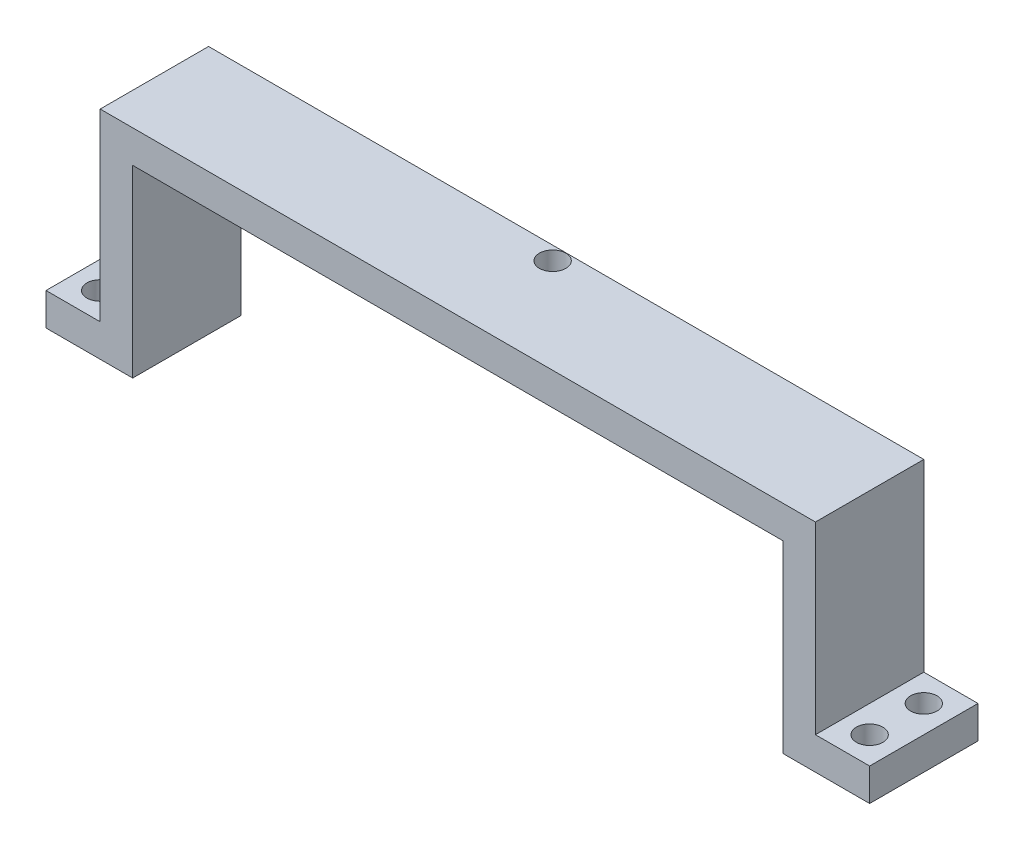
ISO-10303-21;
HEADER;
FILE_DESCRIPTION(('STEP AP214'),'2;1');
FILE_NAME('part.step','',(''),(''),'','','');
FILE_SCHEMA(('AUTOMOTIVE_DESIGN { 1 0 10303 214 1 1 1 1 }'));
ENDSEC;
DATA;
#1=APPLICATION_CONTEXT('core data for automotive mechanical design processes');
#2=APPLICATION_PROTOCOL_DEFINITION('international standard','automotive_design',2000,#1);
#3=PRODUCT_CONTEXT('',#1,'mechanical');
#4=PRODUCT('Part','Part','',(#3));
#5=PRODUCT_RELATED_PRODUCT_CATEGORY('part','',(#4));
#6=PRODUCT_DEFINITION_FORMATION('','',#4);
#7=PRODUCT_DEFINITION_CONTEXT('part definition',#1,'design');
#8=PRODUCT_DEFINITION('design','',#6,#7);
#9=PRODUCT_DEFINITION_SHAPE('','',#8);
#10=(LENGTH_UNIT() NAMED_UNIT(*) SI_UNIT(.MILLI.,.METRE.));
#11=(NAMED_UNIT(*) PLANE_ANGLE_UNIT() SI_UNIT($,.RADIAN.));
#12=(NAMED_UNIT(*) SI_UNIT($,.STERADIAN.) SOLID_ANGLE_UNIT());
#13=UNCERTAINTY_MEASURE_WITH_UNIT(LENGTH_MEASURE(1.E-05),#10,'distance_accuracy_value','');
#14=(GEOMETRIC_REPRESENTATION_CONTEXT(3) GLOBAL_UNCERTAINTY_ASSIGNED_CONTEXT((#13)) GLOBAL_UNIT_ASSIGNED_CONTEXT((#10,
#11,#12)) REPRESENTATION_CONTEXT('',''));
#15=CARTESIAN_POINT('',(0.,0.,0.));
#16=DIRECTION('',(0.,0.,1.));
#17=DIRECTION('',(1.,0.,0.));
#18=AXIS2_PLACEMENT_3D('',#15,#16,#17);
#19=CARTESIAN_POINT('',(0.,0.,0.));
#20=DIRECTION('',(0.,1.,0.));
#21=DIRECTION('',(0.,0.,1.));
#22=AXIS2_PLACEMENT_3D('',#19,#20,#21);
#23=PLANE('',#22);
#24=CARTESIAN_POINT('',(0.,0.,-3.74999999999999));
#25=DIRECTION('',(0.,1.,0.));
#26=DIRECTION('',(0.,0.,1.));
#27=AXIS2_PLACEMENT_3D('',#24,#25,#26);
#28=CIRCLE('',#27,1.22);
#29=CARTESIAN_POINT('',(0.,0.,-2.52999999999999));
#30=VERTEX_POINT('',#29);
#31=EDGE_CURVE('E237',#30,#30,#28,.T.);
#32=ORIENTED_EDGE('',*,*,#31,.T.);
#33=EDGE_LOOP('',(#32));
#34=FACE_BOUND('',#33,.T.);
#35=DIRECTION('',(0.,0.,-1.));
#36=VECTOR('',#35,1.);
#37=CARTESIAN_POINT('',(30.,0.,-5.00000000000001));
#38=LINE('',#37,#36);
#39=CARTESIAN_POINT('',(30.,0.,4.99999999999999));
#40=VERTEX_POINT('',#39);
#41=CARTESIAN_POINT('',(30.,0.,-5.00000000000001));
#42=VERTEX_POINT('',#41);
#43=EDGE_CURVE('E179',#40,#42,#38,.T.);
#44=ORIENTED_EDGE('',*,*,#43,.F.);
#45=DIRECTION('',(-1.,0.,0.));
#46=VECTOR('',#45,1.);
#47=CARTESIAN_POINT('',(0.,0.,5.));
#48=LINE('',#47,#46);
#49=CARTESIAN_POINT('',(-30.,0.,5.00000000000001));
#50=VERTEX_POINT('',#49);
#51=EDGE_CURVE('E37',#40,#50,#48,.T.);
#52=ORIENTED_EDGE('',*,*,#51,.T.);
#53=DIRECTION('',(0.,0.,1.));
#54=VECTOR('',#53,1.);
#55=CARTESIAN_POINT('',(-30.,0.,-4.99999999999999));
#56=LINE('',#55,#54);
#57=CARTESIAN_POINT('',(-30.,0.,-4.99999999999999));
#58=VERTEX_POINT('',#57);
#59=EDGE_CURVE('E56',#58,#50,#56,.T.);
#60=ORIENTED_EDGE('',*,*,#59,.F.);
#61=DIRECTION('',(1.,0.,0.));
#62=VECTOR('',#61,1.);
#63=CARTESIAN_POINT('',(0.,0.,-5.));
#64=LINE('',#63,#62);
#65=EDGE_CURVE('E51',#58,#42,#64,.T.);
#66=ORIENTED_EDGE('',*,*,#65,.T.);
#67=EDGE_LOOP('',(#44,#52,#60,#66));
#68=FACE_BOUND('',#67,.T.);
#69=ADVANCED_FACE('F33',(#34,#68),#23,.F.);
#70=CARTESIAN_POINT('',(33.,3.,0.));
#71=DIRECTION('',(1.,0.,0.));
#72=DIRECTION('',(0.,0.,-1.));
#73=AXIS2_PLACEMENT_3D('',#70,#71,#72);
#74=PLANE('',#73);
#75=DIRECTION('',(0.,-1.,0.));
#76=VECTOR('',#75,1.);
#77=CARTESIAN_POINT('',(33.,3.,4.99999999999999));
#78=LINE('',#77,#76);
#79=CARTESIAN_POINT('',(33.,3.,4.99999999999999));
#80=VERTEX_POINT('',#79);
#81=CARTESIAN_POINT('',(33.,-14.,4.99999999999999));
#82=VERTEX_POINT('',#81);
#83=EDGE_CURVE('E221',#80,#82,#78,.T.);
#84=ORIENTED_EDGE('',*,*,#83,.T.);
#85=DIRECTION('',(0.,0.,1.));
#86=VECTOR('',#85,1.);
#87=CARTESIAN_POINT('',(33.,-14.,4.99999999999999));
#88=LINE('',#87,#86);
#89=CARTESIAN_POINT('',(33.,-14.,-5.00000000000001));
#90=VERTEX_POINT('',#89);
#91=EDGE_CURVE('E180',#90,#82,#88,.T.);
#92=ORIENTED_EDGE('',*,*,#91,.F.);
#93=DIRECTION('',(0.,-1.,0.));
#94=VECTOR('',#93,1.);
#95=CARTESIAN_POINT('',(33.,3.,-5.00000000000001));
#96=LINE('',#95,#94);
#97=CARTESIAN_POINT('',(33.,3.,-5.00000000000001));
#98=VERTEX_POINT('',#97);
#99=EDGE_CURVE('E11',#98,#90,#96,.T.);
#100=ORIENTED_EDGE('',*,*,#99,.F.);
#101=DIRECTION('',(0.,0.,1.));
#102=VECTOR('',#101,1.);
#103=CARTESIAN_POINT('',(33.,3.,0.));
#104=LINE('',#103,#102);
#105=EDGE_CURVE('E196',#98,#80,#104,.T.);
#106=ORIENTED_EDGE('',*,*,#105,.T.);
#107=EDGE_LOOP('',(#84,#92,#100,#106));
#108=FACE_BOUND('',#107,.T.);
#109=ADVANCED_FACE('F35',(#108),#74,.T.);
#110=CARTESIAN_POINT('',(0.,3.,-5.));
#111=DIRECTION('',(0.,0.,-1.));
#112=DIRECTION('',(-1.,0.,0.));
#113=AXIS2_PLACEMENT_3D('',#110,#111,#112);
#114=PLANE('',#113);
#115=ORIENTED_EDGE('',*,*,#65,.F.);
#116=DIRECTION('',(0.,1.,0.));
#117=VECTOR('',#116,1.);
#118=CARTESIAN_POINT('',(-30.,-14.,-4.99999999999999));
#119=LINE('',#118,#117);
#120=CARTESIAN_POINT('',(-30.,-17.,-4.99999999999999));
#121=VERTEX_POINT('',#120);
#122=EDGE_CURVE('E132',#121,#58,#119,.T.);
#123=ORIENTED_EDGE('',*,*,#122,.F.);
#124=DIRECTION('',(1.,0.,0.));
#125=VECTOR('',#124,1.);
#126=CARTESIAN_POINT('',(0.,-17.,-5.));
#127=LINE('',#126,#125);
#128=CARTESIAN_POINT('',(-38.,-17.,-4.99999999999999));
#129=VERTEX_POINT('',#128);
#130=EDGE_CURVE('E124',#129,#121,#127,.T.);
#131=ORIENTED_EDGE('',*,*,#130,.F.);
#132=DIRECTION('',(0.,1.,0.));
#133=VECTOR('',#132,1.);
#134=CARTESIAN_POINT('',(-38.,-17.,-4.99999999999999));
#135=LINE('',#134,#133);
#136=CARTESIAN_POINT('',(-38.,-14.,-4.99999999999999));
#137=VERTEX_POINT('',#136);
#138=EDGE_CURVE('E129',#129,#137,#135,.T.);
#139=ORIENTED_EDGE('',*,*,#138,.T.);
#140=DIRECTION('',(1.,0.,0.));
#141=VECTOR('',#140,1.);
#142=CARTESIAN_POINT('',(0.,-14.,-5.));
#143=LINE('',#142,#141);
#144=CARTESIAN_POINT('',(-33.,-14.,-4.99999999999999));
#145=VERTEX_POINT('',#144);
#146=EDGE_CURVE('E235',#137,#145,#143,.T.);
#147=ORIENTED_EDGE('',*,*,#146,.T.);
#148=DIRECTION('',(0.,-1.,0.));
#149=VECTOR('',#148,1.);
#150=CARTESIAN_POINT('',(-33.,3.,-4.99999999999999));
#151=LINE('',#150,#149);
#152=CARTESIAN_POINT('',(-33.,3.,-4.99999999999999));
#153=VERTEX_POINT('',#152);
#154=EDGE_CURVE('E43',#153,#145,#151,.T.);
#155=ORIENTED_EDGE('',*,*,#154,.F.);
#156=DIRECTION('',(1.,0.,0.));
#157=VECTOR('',#156,1.);
#158=CARTESIAN_POINT('',(0.,3.,-5.));
#159=LINE('',#158,#157);
#160=EDGE_CURVE('E209',#153,#98,#159,.T.);
#161=ORIENTED_EDGE('',*,*,#160,.T.);
#162=ORIENTED_EDGE('',*,*,#99,.T.);
#163=DIRECTION('',(1.,0.,0.));
#164=VECTOR('',#163,1.);
#165=CARTESIAN_POINT('',(0.,-14.,-5.00000000000001));
#166=LINE('',#165,#164);
#167=CARTESIAN_POINT('',(38.,-14.,-5.00000000000001));
#168=VERTEX_POINT('',#167);
#169=EDGE_CURVE('E155',#90,#168,#166,.T.);
#170=ORIENTED_EDGE('',*,*,#169,.T.);
#171=DIRECTION('',(0.,1.,0.));
#172=VECTOR('',#171,1.);
#173=CARTESIAN_POINT('',(38.,-17.,-5.00000000000001));
#174=LINE('',#173,#172);
#175=CARTESIAN_POINT('',(38.,-17.,-5.00000000000001));
#176=VERTEX_POINT('',#175);
#177=EDGE_CURVE('E176',#176,#168,#174,.T.);
#178=ORIENTED_EDGE('',*,*,#177,.F.);
#179=DIRECTION('',(1.,0.,0.));
#180=VECTOR('',#179,1.);
#181=CARTESIAN_POINT('',(0.,-17.,-5.00000000000001));
#182=LINE('',#181,#180);
#183=CARTESIAN_POINT('',(30.,-17.,-5.00000000000001));
#184=VERTEX_POINT('',#183);
#185=EDGE_CURVE('E167',#184,#176,#182,.T.);
#186=ORIENTED_EDGE('',*,*,#185,.F.);
#187=DIRECTION('',(0.,1.,0.));
#188=VECTOR('',#187,1.);
#189=CARTESIAN_POINT('',(30.,-14.,-5.00000000000001));
#190=LINE('',#189,#188);
#191=EDGE_CURVE('E183',#184,#42,#190,.T.);
#192=ORIENTED_EDGE('',*,*,#191,.T.);
#193=EDGE_LOOP('',(#115,#123,#131,#139,#147,#155,#161,#162,#170,#178,#186,#192));
#194=FACE_BOUND('',#193,.T.);
#195=ADVANCED_FACE('F126',(#194),#114,.T.);
#196=CARTESIAN_POINT('',(-33.,3.,0.));
#197=DIRECTION('',(-1.,0.,0.));
#198=DIRECTION('',(0.,0.,1.));
#199=AXIS2_PLACEMENT_3D('',#196,#197,#198);
#200=PLANE('',#199);
#201=ORIENTED_EDGE('',*,*,#154,.T.);
#202=DIRECTION('',(0.,0.,-1.));
#203=VECTOR('',#202,1.);
#204=CARTESIAN_POINT('',(-33.,-14.,5.00000000000001));
#205=LINE('',#204,#203);
#206=CARTESIAN_POINT('',(-33.,-14.,5.00000000000001));
#207=VERTEX_POINT('',#206);
#208=EDGE_CURVE('E190',#207,#145,#205,.T.);
#209=ORIENTED_EDGE('',*,*,#208,.F.);
#210=DIRECTION('',(0.,-1.,0.));
#211=VECTOR('',#210,1.);
#212=CARTESIAN_POINT('',(-33.,3.,5.00000000000001));
#213=LINE('',#212,#211);
#214=CARTESIAN_POINT('',(-33.,3.,5.00000000000001));
#215=VERTEX_POINT('',#214);
#216=EDGE_CURVE('E226',#215,#207,#213,.T.);
#217=ORIENTED_EDGE('',*,*,#216,.F.);
#218=DIRECTION('',(0.,0.,-1.));
#219=VECTOR('',#218,1.);
#220=CARTESIAN_POINT('',(-33.,3.,0.));
#221=LINE('',#220,#219);
#222=EDGE_CURVE('E214',#215,#153,#221,.T.);
#223=ORIENTED_EDGE('',*,*,#222,.T.);
#224=EDGE_LOOP('',(#201,#209,#217,#223));
#225=FACE_BOUND('',#224,.T.);
#226=ADVANCED_FACE('F230',(#225),#200,.T.);
#227=CARTESIAN_POINT('',(0.,3.,5.));
#228=DIRECTION('',(0.,0.,1.));
#229=DIRECTION('',(1.,0.,0.));
#230=AXIS2_PLACEMENT_3D('',#227,#228,#229);
#231=PLANE('',#230);
#232=ORIENTED_EDGE('',*,*,#51,.F.);
#233=DIRECTION('',(0.,1.,0.));
#234=VECTOR('',#233,1.);
#235=CARTESIAN_POINT('',(30.,-14.,4.99999999999999));
#236=LINE('',#235,#234);
#237=CARTESIAN_POINT('',(30.,-17.,4.99999999999999));
#238=VERTEX_POINT('',#237);
#239=EDGE_CURVE('E187',#238,#40,#236,.T.);
#240=ORIENTED_EDGE('',*,*,#239,.F.);
#241=DIRECTION('',(-1.,0.,0.));
#242=VECTOR('',#241,1.);
#243=CARTESIAN_POINT('',(0.,-17.,4.99999999999992));
#244=LINE('',#243,#242);
#245=CARTESIAN_POINT('',(38.,-17.,5.00000000000001));
#246=VERTEX_POINT('',#245);
#247=EDGE_CURVE('E160',#246,#238,#244,.T.);
#248=ORIENTED_EDGE('',*,*,#247,.F.);
#249=DIRECTION('',(0.,1.,0.));
#250=VECTOR('',#249,1.);
#251=CARTESIAN_POINT('',(38.,-17.,5.00000000000001));
#252=LINE('',#251,#250);
#253=CARTESIAN_POINT('',(38.,-14.,5.00000000000001));
#254=VERTEX_POINT('',#253);
#255=EDGE_CURVE('E170',#246,#254,#252,.T.);
#256=ORIENTED_EDGE('',*,*,#255,.T.);
#257=DIRECTION('',(-1.,0.,0.));
#258=VECTOR('',#257,1.);
#259=CARTESIAN_POINT('',(0.,-14.,4.99999999999992));
#260=LINE('',#259,#258);
#261=EDGE_CURVE('E151',#254,#82,#260,.T.);
#262=ORIENTED_EDGE('',*,*,#261,.T.);
#263=ORIENTED_EDGE('',*,*,#83,.F.);
#264=DIRECTION('',(-1.,0.,0.));
#265=VECTOR('',#264,1.);
#266=CARTESIAN_POINT('',(0.,3.,5.));
#267=LINE('',#266,#265);
#268=EDGE_CURVE('E217',#80,#215,#267,.T.);
#269=ORIENTED_EDGE('',*,*,#268,.T.);
#270=ORIENTED_EDGE('',*,*,#216,.T.);
#271=DIRECTION('',(-1.,0.,0.));
#272=VECTOR('',#271,1.);
#273=CARTESIAN_POINT('',(0.,-14.,5.00000000000001));
#274=LINE('',#273,#272);
#275=CARTESIAN_POINT('',(-38.,-14.,5.00000000000001));
#276=VERTEX_POINT('',#275);
#277=EDGE_CURVE('E146',#207,#276,#274,.T.);
#278=ORIENTED_EDGE('',*,*,#277,.T.);
#279=DIRECTION('',(0.,1.,0.));
#280=VECTOR('',#279,1.);
#281=CARTESIAN_POINT('',(-38.,-17.,5.00000000000001));
#282=LINE('',#281,#280);
#283=CARTESIAN_POINT('',(-38.,-17.,5.00000000000001));
#284=VERTEX_POINT('',#283);
#285=EDGE_CURVE('E152',#284,#276,#282,.T.);
#286=ORIENTED_EDGE('',*,*,#285,.F.);
#287=DIRECTION('',(-1.,0.,0.));
#288=VECTOR('',#287,1.);
#289=CARTESIAN_POINT('',(0.,-17.,5.00000000000001));
#290=LINE('',#289,#288);
#291=CARTESIAN_POINT('',(-30.,-17.,5.00000000000001));
#292=VERTEX_POINT('',#291);
#293=EDGE_CURVE('E142',#292,#284,#290,.T.);
#294=ORIENTED_EDGE('',*,*,#293,.F.);
#295=DIRECTION('',(0.,1.,0.));
#296=VECTOR('',#295,1.);
#297=CARTESIAN_POINT('',(-30.,-14.,5.00000000000001));
#298=LINE('',#297,#296);
#299=EDGE_CURVE('E193',#292,#50,#298,.T.);
#300=ORIENTED_EDGE('',*,*,#299,.T.);
#301=EDGE_LOOP('',(#232,#240,#248,#256,#262,#263,#269,#270,#278,#286,#294,#300));
#302=FACE_BOUND('',#301,.T.);
#303=ADVANCED_FACE('F297',(#302),#231,.T.);
#304=CARTESIAN_POINT('',(0.,3.,0.));
#305=DIRECTION('',(0.,1.,0.));
#306=DIRECTION('',(0.,0.,1.));
#307=AXIS2_PLACEMENT_3D('',#304,#305,#306);
#308=PLANE('',#307);
#309=CARTESIAN_POINT('',(0.,3.,-3.74999999999999));
#310=DIRECTION('',(0.,1.,0.));
#311=DIRECTION('',(0.,0.,1.));
#312=AXIS2_PLACEMENT_3D('',#309,#310,#311);
#313=CIRCLE('',#312,1.22);
#314=CARTESIAN_POINT('',(0.,3.,-2.52999999999999));
#315=VERTEX_POINT('',#314);
#316=EDGE_CURVE('E244',#315,#315,#313,.T.);
#317=ORIENTED_EDGE('',*,*,#316,.F.);
#318=EDGE_LOOP('',(#317));
#319=FACE_BOUND('',#318,.T.);
#320=ORIENTED_EDGE('',*,*,#105,.F.);
#321=ORIENTED_EDGE('',*,*,#160,.F.);
#322=ORIENTED_EDGE('',*,*,#222,.F.);
#323=ORIENTED_EDGE('',*,*,#268,.F.);
#324=EDGE_LOOP('',(#320,#321,#322,#323));
#325=FACE_BOUND('',#324,.T.);
#326=ADVANCED_FACE('F295',(#319,#325),#308,.T.);
#327=CARTESIAN_POINT('',(-30.,-14.,-4.99999999999999));
#328=DIRECTION('',(-1.,0.,0.));
#329=DIRECTION('',(0.,0.,1.));
#330=AXIS2_PLACEMENT_3D('',#327,#328,#329);
#331=PLANE('',#330);
#332=ORIENTED_EDGE('',*,*,#59,.T.);
#333=ORIENTED_EDGE('',*,*,#299,.F.);
#334=DIRECTION('',(0.,0.,1.));
#335=VECTOR('',#334,1.);
#336=CARTESIAN_POINT('',(-30.,-17.,0.));
#337=LINE('',#336,#335);
#338=EDGE_CURVE('E136',#121,#292,#337,.T.);
#339=ORIENTED_EDGE('',*,*,#338,.F.);
#340=ORIENTED_EDGE('',*,*,#122,.T.);
#341=EDGE_LOOP('',(#332,#333,#339,#340));
#342=FACE_BOUND('',#341,.T.);
#343=ADVANCED_FACE('F322',(#342),#331,.F.);
#344=CARTESIAN_POINT('',(30.,-14.,-5.00000000000001));
#345=DIRECTION('',(1.,0.,0.));
#346=DIRECTION('',(0.,0.,-1.));
#347=AXIS2_PLACEMENT_3D('',#344,#345,#346);
#348=PLANE('',#347);
#349=ORIENTED_EDGE('',*,*,#43,.T.);
#350=ORIENTED_EDGE('',*,*,#191,.F.);
#351=DIRECTION('',(0.,0.,-1.));
#352=VECTOR('',#351,1.);
#353=CARTESIAN_POINT('',(30.,-17.,0.));
#354=LINE('',#353,#352);
#355=EDGE_CURVE('E163',#238,#184,#354,.T.);
#356=ORIENTED_EDGE('',*,*,#355,.F.);
#357=ORIENTED_EDGE('',*,*,#239,.T.);
#358=EDGE_LOOP('',(#349,#350,#356,#357));
#359=FACE_BOUND('',#358,.T.);
#360=ADVANCED_FACE('F329',(#359),#348,.F.);
#361=CARTESIAN_POINT('',(38.,-17.,0.));
#362=DIRECTION('',(-1.,0.,0.));
#363=DIRECTION('',(0.,0.,1.));
#364=AXIS2_PLACEMENT_3D('',#361,#362,#363);
#365=PLANE('',#364);
#366=DIRECTION('',(0.,0.,1.));
#367=VECTOR('',#366,1.);
#368=CARTESIAN_POINT('',(38.,-14.,0.));
#369=LINE('',#368,#367);
#370=EDGE_CURVE('E164',#168,#254,#369,.T.);
#371=ORIENTED_EDGE('',*,*,#370,.T.);
#372=ORIENTED_EDGE('',*,*,#255,.F.);
#373=DIRECTION('',(0.,0.,1.));
#374=VECTOR('',#373,1.);
#375=CARTESIAN_POINT('',(38.,-17.,0.));
#376=LINE('',#375,#374);
#377=EDGE_CURVE('E169',#176,#246,#376,.T.);
#378=ORIENTED_EDGE('',*,*,#377,.F.);
#379=ORIENTED_EDGE('',*,*,#177,.T.);
#380=EDGE_LOOP('',(#371,#372,#378,#379));
#381=FACE_BOUND('',#380,.T.);
#382=ADVANCED_FACE('F335',(#381),#365,.F.);
#383=CARTESIAN_POINT('',(0.,-17.,0.));
#384=DIRECTION('',(0.,-1.,0.));
#385=DIRECTION('',(0.,0.,-1.));
#386=AXIS2_PLACEMENT_3D('',#383,#384,#385);
#387=PLANE('',#386);
#388=CARTESIAN_POINT('',(35.5,-17.,-2.49999999999999));
#389=DIRECTION('',(0.,-1.,0.));
#390=DIRECTION('',(0.,0.,-1.));
#391=AXIS2_PLACEMENT_3D('',#388,#389,#390);
#392=CIRCLE('',#391,1.22);
#393=CARTESIAN_POINT('',(35.5,-17.,-3.71999999999999));
#394=VERTEX_POINT('',#393);
#395=EDGE_CURVE('E265',#394,#394,#392,.F.);
#396=ORIENTED_EDGE('',*,*,#395,.T.);
#397=EDGE_LOOP('',(#396));
#398=FACE_BOUND('',#397,.T.);
#399=CARTESIAN_POINT('',(35.5,-17.,2.50000000000001));
#400=DIRECTION('',(0.,-1.,0.));
#401=DIRECTION('',(0.,0.,-1.));
#402=AXIS2_PLACEMENT_3D('',#399,#400,#401);
#403=CIRCLE('',#402,1.22);
#404=CARTESIAN_POINT('',(35.5,-17.,1.28000000000001));
#405=VERTEX_POINT('',#404);
#406=EDGE_CURVE('E259',#405,#405,#403,.F.);
#407=ORIENTED_EDGE('',*,*,#406,.T.);
#408=EDGE_LOOP('',(#407));
#409=FACE_BOUND('',#408,.T.);
#410=ORIENTED_EDGE('',*,*,#247,.T.);
#411=ORIENTED_EDGE('',*,*,#355,.T.);
#412=ORIENTED_EDGE('',*,*,#185,.T.);
#413=ORIENTED_EDGE('',*,*,#377,.T.);
#414=EDGE_LOOP('',(#410,#411,#412,#413));
#415=FACE_BOUND('',#414,.T.);
#416=ADVANCED_FACE('F343',(#398,#409,#415),#387,.T.);
#417=CARTESIAN_POINT('',(0.,-14.,0.));
#418=DIRECTION('',(0.,-1.,0.));
#419=DIRECTION('',(0.,0.,-1.));
#420=AXIS2_PLACEMENT_3D('',#417,#418,#419);
#421=PLANE('',#420);
#422=CARTESIAN_POINT('',(35.5,-14.,-2.49999999999999));
#423=DIRECTION('',(0.,-1.,0.));
#424=DIRECTION('',(0.,0.,1.));
#425=AXIS2_PLACEMENT_3D('',#422,#423,#424);
#426=CIRCLE('',#425,1.22);
#427=CARTESIAN_POINT('',(35.5,-14.,-1.27999999999999));
#428=VERTEX_POINT('',#427);
#429=EDGE_CURVE('E268',#428,#428,#426,.T.);
#430=ORIENTED_EDGE('',*,*,#429,.T.);
#431=EDGE_LOOP('',(#430));
#432=FACE_BOUND('',#431,.T.);
#433=CARTESIAN_POINT('',(35.5,-14.,2.50000000000001));
#434=DIRECTION('',(0.,-1.,0.));
#435=DIRECTION('',(0.,0.,1.));
#436=AXIS2_PLACEMENT_3D('',#433,#434,#435);
#437=CIRCLE('',#436,1.22);
#438=CARTESIAN_POINT('',(35.5,-14.,3.72000000000001));
#439=VERTEX_POINT('',#438);
#440=EDGE_CURVE('E262',#439,#439,#437,.T.);
#441=ORIENTED_EDGE('',*,*,#440,.T.);
#442=EDGE_LOOP('',(#441));
#443=FACE_BOUND('',#442,.T.);
#444=ORIENTED_EDGE('',*,*,#91,.T.);
#445=ORIENTED_EDGE('',*,*,#261,.F.);
#446=ORIENTED_EDGE('',*,*,#370,.F.);
#447=ORIENTED_EDGE('',*,*,#169,.F.);
#448=EDGE_LOOP('',(#444,#445,#446,#447));
#449=FACE_BOUND('',#448,.T.);
#450=ADVANCED_FACE('F272',(#432,#443,#449),#421,.F.);
#451=CARTESIAN_POINT('',(-38.,-17.,0.));
#452=DIRECTION('',(1.,0.,0.));
#453=DIRECTION('',(0.,0.,-1.));
#454=AXIS2_PLACEMENT_3D('',#451,#452,#453);
#455=PLANE('',#454);
#456=DIRECTION('',(0.,0.,-1.));
#457=VECTOR('',#456,1.);
#458=CARTESIAN_POINT('',(-38.,-14.,0.));
#459=LINE('',#458,#457);
#460=EDGE_CURVE('E150',#276,#137,#459,.T.);
#461=ORIENTED_EDGE('',*,*,#460,.T.);
#462=ORIENTED_EDGE('',*,*,#138,.F.);
#463=DIRECTION('',(0.,0.,-1.));
#464=VECTOR('',#463,1.);
#465=CARTESIAN_POINT('',(-38.,-17.,0.));
#466=LINE('',#465,#464);
#467=EDGE_CURVE('E137',#284,#129,#466,.T.);
#468=ORIENTED_EDGE('',*,*,#467,.F.);
#469=ORIENTED_EDGE('',*,*,#285,.T.);
#470=EDGE_LOOP('',(#461,#462,#468,#469));
#471=FACE_BOUND('',#470,.T.);
#472=ADVANCED_FACE('F148',(#471),#455,.F.);
#473=CARTESIAN_POINT('',(0.,-17.,0.));
#474=DIRECTION('',(0.,-1.,0.));
#475=DIRECTION('',(0.,0.,-1.));
#476=AXIS2_PLACEMENT_3D('',#473,#474,#475);
#477=PLANE('',#476);
#478=CARTESIAN_POINT('',(-35.5,-17.,-2.49999999999999));
#479=DIRECTION('',(0.,-1.,0.));
#480=DIRECTION('',(0.,0.,-1.));
#481=AXIS2_PLACEMENT_3D('',#478,#479,#480);
#482=CIRCLE('',#481,1.22);
#483=CARTESIAN_POINT('',(-35.5,-17.,-3.71999999999999));
#484=VERTEX_POINT('',#483);
#485=EDGE_CURVE('E253',#484,#484,#482,.T.);
#486=ORIENTED_EDGE('',*,*,#485,.F.);
#487=EDGE_LOOP('',(#486));
#488=FACE_BOUND('',#487,.T.);
#489=CARTESIAN_POINT('',(-35.5,-17.,2.50000000000001));
#490=DIRECTION('',(0.,-1.,0.));
#491=DIRECTION('',(0.,0.,-1.));
#492=AXIS2_PLACEMENT_3D('',#489,#490,#491);
#493=CIRCLE('',#492,1.22);
#494=CARTESIAN_POINT('',(-35.5,-17.,1.28000000000001));
#495=VERTEX_POINT('',#494);
#496=EDGE_CURVE('E247',#495,#495,#493,.T.);
#497=ORIENTED_EDGE('',*,*,#496,.F.);
#498=EDGE_LOOP('',(#497));
#499=FACE_BOUND('',#498,.T.);
#500=ORIENTED_EDGE('',*,*,#467,.T.);
#501=ORIENTED_EDGE('',*,*,#130,.T.);
#502=ORIENTED_EDGE('',*,*,#338,.T.);
#503=ORIENTED_EDGE('',*,*,#293,.T.);
#504=EDGE_LOOP('',(#500,#501,#502,#503));
#505=FACE_BOUND('',#504,.T.);
#506=ADVANCED_FACE('F140',(#488,#499,#505),#477,.T.);
#507=CARTESIAN_POINT('',(0.,-14.,0.));
#508=DIRECTION('',(0.,-1.,0.));
#509=DIRECTION('',(0.,0.,-1.));
#510=AXIS2_PLACEMENT_3D('',#507,#508,#509);
#511=PLANE('',#510);
#512=CARTESIAN_POINT('',(-35.5,-14.,-2.49999999999999));
#513=DIRECTION('',(0.,1.,0.));
#514=DIRECTION('',(0.,0.,1.));
#515=AXIS2_PLACEMENT_3D('',#512,#513,#514);
#516=CIRCLE('',#515,1.22);
#517=CARTESIAN_POINT('',(-35.5,-14.,-1.27999999999999));
#518=VERTEX_POINT('',#517);
#519=EDGE_CURVE('E256',#518,#518,#516,.T.);
#520=ORIENTED_EDGE('',*,*,#519,.F.);
#521=EDGE_LOOP('',(#520));
#522=FACE_BOUND('',#521,.T.);
#523=CARTESIAN_POINT('',(-35.5,-14.,2.50000000000001));
#524=DIRECTION('',(0.,1.,0.));
#525=DIRECTION('',(0.,0.,1.));
#526=AXIS2_PLACEMENT_3D('',#523,#524,#525);
#527=CIRCLE('',#526,1.22);
#528=CARTESIAN_POINT('',(-35.5,-14.,3.72000000000001));
#529=VERTEX_POINT('',#528);
#530=EDGE_CURVE('E250',#529,#529,#527,.T.);
#531=ORIENTED_EDGE('',*,*,#530,.F.);
#532=EDGE_LOOP('',(#531));
#533=FACE_BOUND('',#532,.T.);
#534=ORIENTED_EDGE('',*,*,#208,.T.);
#535=ORIENTED_EDGE('',*,*,#146,.F.);
#536=ORIENTED_EDGE('',*,*,#460,.F.);
#537=ORIENTED_EDGE('',*,*,#277,.F.);
#538=EDGE_LOOP('',(#534,#535,#536,#537));
#539=FACE_BOUND('',#538,.T.);
#540=ADVANCED_FACE('F234',(#522,#533,#539),#511,.F.);
#541=CARTESIAN_POINT('',(0.,-17.000025,-3.74999999999999));
#542=DIRECTION('',(0.,1.,0.));
#543=DIRECTION('',(0.,0.,1.));
#544=AXIS2_PLACEMENT_3D('',#541,#542,#543);
#545=CYLINDRICAL_SURFACE('',#544,1.22);
#546=CARTESIAN_POINT('',(0.,3.,-2.52999999999999));
#547=CARTESIAN_POINT('',(0.,2.96875,-2.52999999999999));
#548=CARTESIAN_POINT('',(0.,2.9375,-2.52999999999999));
#549=CARTESIAN_POINT('',(0.,2.875,-2.52999999999999));
#550=CARTESIAN_POINT('',(0.,2.84375,-2.52999999999999));
#551=CARTESIAN_POINT('',(0.,2.78125,-2.52999999999999));
#552=CARTESIAN_POINT('',(0.,2.75,-2.52999999999999));
#553=CARTESIAN_POINT('',(0.,2.6875,-2.52999999999999));
#554=CARTESIAN_POINT('',(0.,2.65625,-2.52999999999999));
#555=CARTESIAN_POINT('',(0.,2.59375,-2.52999999999999));
#556=CARTESIAN_POINT('',(0.,2.5625,-2.52999999999999));
#557=CARTESIAN_POINT('',(0.,2.5,-2.52999999999999));
#558=CARTESIAN_POINT('',(0.,2.46875,-2.52999999999999));
#559=CARTESIAN_POINT('',(0.,2.40625,-2.52999999999999));
#560=CARTESIAN_POINT('',(0.,2.375,-2.52999999999999));
#561=CARTESIAN_POINT('',(0.,2.3125,-2.52999999999999));
#562=CARTESIAN_POINT('',(0.,2.28125,-2.52999999999999));
#563=CARTESIAN_POINT('',(0.,2.21875,-2.52999999999999));
#564=CARTESIAN_POINT('',(0.,2.1875,-2.52999999999999));
#565=CARTESIAN_POINT('',(0.,2.125,-2.52999999999999));
#566=CARTESIAN_POINT('',(0.,2.09375,-2.52999999999999));
#567=CARTESIAN_POINT('',(0.,2.03125,-2.52999999999999));
#568=CARTESIAN_POINT('',(0.,2.,-2.52999999999999));
#569=CARTESIAN_POINT('',(0.,1.9375,-2.52999999999999));
#570=CARTESIAN_POINT('',(0.,1.90625,-2.52999999999999));
#571=CARTESIAN_POINT('',(0.,1.84375,-2.52999999999999));
#572=CARTESIAN_POINT('',(0.,1.8125,-2.52999999999999));
#573=CARTESIAN_POINT('',(0.,1.75,-2.52999999999999));
#574=CARTESIAN_POINT('',(0.,1.71875,-2.52999999999999));
#575=CARTESIAN_POINT('',(0.,1.65625,-2.52999999999999));
#576=CARTESIAN_POINT('',(0.,1.625,-2.52999999999999));
#577=CARTESIAN_POINT('',(0.,1.5625,-2.52999999999999));
#578=CARTESIAN_POINT('',(0.,1.53125,-2.52999999999999));
#579=CARTESIAN_POINT('',(0.,1.46875,-2.52999999999999));
#580=CARTESIAN_POINT('',(0.,1.4375,-2.52999999999999));
#581=CARTESIAN_POINT('',(0.,1.375,-2.52999999999999));
#582=CARTESIAN_POINT('',(0.,1.34375,-2.52999999999999));
#583=CARTESIAN_POINT('',(0.,1.28125,-2.52999999999999));
#584=CARTESIAN_POINT('',(0.,1.25,-2.52999999999999));
#585=CARTESIAN_POINT('',(0.,1.1875,-2.52999999999999));
#586=CARTESIAN_POINT('',(0.,1.15625,-2.52999999999999));
#587=CARTESIAN_POINT('',(0.,1.09375,-2.52999999999999));
#588=CARTESIAN_POINT('',(0.,1.0625,-2.52999999999999));
#589=CARTESIAN_POINT('',(0.,0.999999999999997,-2.52999999999999));
#590=CARTESIAN_POINT('',(0.,0.968749999999997,-2.52999999999999));
#591=CARTESIAN_POINT('',(0.,0.906249999999997,-2.52999999999999));
#592=CARTESIAN_POINT('',(0.,0.874999999999997,-2.52999999999999));
#593=CARTESIAN_POINT('',(0.,0.812499999999997,-2.52999999999999));
#594=CARTESIAN_POINT('',(0.,0.781249999999997,-2.52999999999999));
#595=CARTESIAN_POINT('',(0.,0.718749999999997,-2.52999999999999));
#596=CARTESIAN_POINT('',(0.,0.687499999999997,-2.52999999999999));
#597=CARTESIAN_POINT('',(0.,0.624999999999997,-2.52999999999999));
#598=CARTESIAN_POINT('',(0.,0.593749999999997,-2.52999999999999));
#599=CARTESIAN_POINT('',(0.,0.531249999999997,-2.52999999999999));
#600=CARTESIAN_POINT('',(0.,0.499999999999997,-2.52999999999999));
#601=CARTESIAN_POINT('',(0.,0.437499999999997,-2.52999999999999));
#602=CARTESIAN_POINT('',(0.,0.406249999999997,-2.52999999999999));
#603=CARTESIAN_POINT('',(0.,0.343749999999997,-2.52999999999999));
#604=CARTESIAN_POINT('',(0.,0.312499999999997,-2.52999999999999));
#605=CARTESIAN_POINT('',(0.,0.249999999999997,-2.52999999999999));
#606=CARTESIAN_POINT('',(0.,0.218749999999997,-2.52999999999999));
#607=CARTESIAN_POINT('',(0.,0.156249999999997,-2.52999999999999));
#608=CARTESIAN_POINT('',(0.,0.124999999999997,-2.52999999999999));
#609=CARTESIAN_POINT('',(0.,0.0624999999999966,-2.52999999999999));
#610=CARTESIAN_POINT('',(0.,0.0312499999999966,-2.52999999999999));
#611=CARTESIAN_POINT('',(0.,0.,-2.52999999999999));
#612=B_SPLINE_CURVE_WITH_KNOTS('',3,(#546,#547,#548,#549,#550,#551,#552,#553,#554,#555,#556,
#557,#558,#559,#560,#561,#562,#563,#564,#565,#566,#567,#568,#569,#570,#571,#572,#573,#574,#575,
#576,#577,#578,#579,#580,#581,#582,#583,#584,#585,#586,#587,#588,#589,#590,#591,#592,#593,#594,
#595,#596,#597,#598,#599,#600,#601,#602,#603,#604,#605,#606,#607,#608,#609,#610,#611),
.UNSPECIFIED.,.F.,.F.,(4,2,2,2,2,2,2,2,2,2,2,2,2,2,2,2,2,2,2,2,2,2,2,2,2,2,2,2,2,2,2,2,4),(0.,
0.0937500000000001,0.1875,0.28125,0.375,0.46875,0.5625,0.656250000000001,0.750000000000001,
0.843750000000001,0.937500000000001,1.03125,1.125,1.21875,1.3125,1.40625,1.5,1.59375,1.6875,
1.78125,1.875,1.96875,2.0625,2.15625,2.25,2.34375,2.4375,2.53125,2.625,2.71875,2.8125,2.90625,
3.),.UNSPECIFIED.);
#613=EDGE_CURVE('BSEAM379',#315,#30,#612,.T.);
#614=ORIENTED_EDGE('',*,*,#316,.T.);
#615=ORIENTED_EDGE('',*,*,#31,.F.);
#616=ORIENTED_EDGE('',*,*,#613,.T.);
#617=ORIENTED_EDGE('',*,*,#613,.F.);
#618=EDGE_LOOP('',(#614,#616,#615,#617));
#619=FACE_BOUND('',#618,.T.);
#620=ADVANCED_FACE('F379',(#619),#545,.F.);
#621=CARTESIAN_POINT('',(-35.5,-17.000025,2.50000000000001));
#622=DIRECTION('',(0.,1.,0.));
#623=DIRECTION('',(0.,0.,1.));
#624=AXIS2_PLACEMENT_3D('',#621,#622,#623);
#625=CYLINDRICAL_SURFACE('',#624,1.22);
#626=ORIENTED_EDGE('',*,*,#496,.T.);
#627=EDGE_LOOP('',(#626));
#628=FACE_BOUND('',#627,.T.);
#629=ORIENTED_EDGE('',*,*,#530,.T.);
#630=EDGE_LOOP('',(#629));
#631=FACE_BOUND('',#630,.T.);
#632=ADVANCED_FACE('F387',(#628,#631),#625,.F.);
#633=CARTESIAN_POINT('',(-35.5,-17.000025,-2.49999999999999));
#634=DIRECTION('',(0.,1.,0.));
#635=DIRECTION('',(0.,0.,1.));
#636=AXIS2_PLACEMENT_3D('',#633,#634,#635);
#637=CYLINDRICAL_SURFACE('',#636,1.22);
#638=ORIENTED_EDGE('',*,*,#485,.T.);
#639=EDGE_LOOP('',(#638));
#640=FACE_BOUND('',#639,.T.);
#641=ORIENTED_EDGE('',*,*,#519,.T.);
#642=EDGE_LOOP('',(#641));
#643=FACE_BOUND('',#642,.T.);
#644=ADVANCED_FACE('F283',(#640,#643),#637,.F.);
#645=CARTESIAN_POINT('',(35.5,-17.000025,2.50000000000001));
#646=DIRECTION('',(0.,1.,0.));
#647=DIRECTION('',(0.,0.,1.));
#648=AXIS2_PLACEMENT_3D('',#645,#646,#647);
#649=CYLINDRICAL_SURFACE('',#648,1.22);
#650=ORIENTED_EDGE('',*,*,#406,.F.);
#651=EDGE_LOOP('',(#650));
#652=FACE_BOUND('',#651,.T.);
#653=ORIENTED_EDGE('',*,*,#440,.F.);
#654=EDGE_LOOP('',(#653));
#655=FACE_BOUND('',#654,.T.);
#656=ADVANCED_FACE('F277',(#652,#655),#649,.F.);
#657=CARTESIAN_POINT('',(35.5,-17.000025,-2.49999999999999));
#658=DIRECTION('',(0.,1.,0.));
#659=DIRECTION('',(0.,0.,1.));
#660=AXIS2_PLACEMENT_3D('',#657,#658,#659);
#661=CYLINDRICAL_SURFACE('',#660,1.22);
#662=ORIENTED_EDGE('',*,*,#395,.F.);
#663=EDGE_LOOP('',(#662));
#664=FACE_BOUND('',#663,.T.);
#665=ORIENTED_EDGE('',*,*,#429,.F.);
#666=EDGE_LOOP('',(#665));
#667=FACE_BOUND('',#666,.T.);
#668=ADVANCED_FACE('F275',(#664,#667),#661,.F.);
#669=CLOSED_SHELL('',(#69,#109,#195,#226,#303,#326,#343,#360,#382,#416,#450,#472,#506,#540,#620,
#632,#644,#656,#668));
#670=MANIFOLD_SOLID_BREP('B2',#669);
#671=ADVANCED_BREP_SHAPE_REPRESENTATION('',(#18,#670),#14);
#672=SHAPE_DEFINITION_REPRESENTATION(#9,#671);
ENDSEC;
END-ISO-10303-21;
